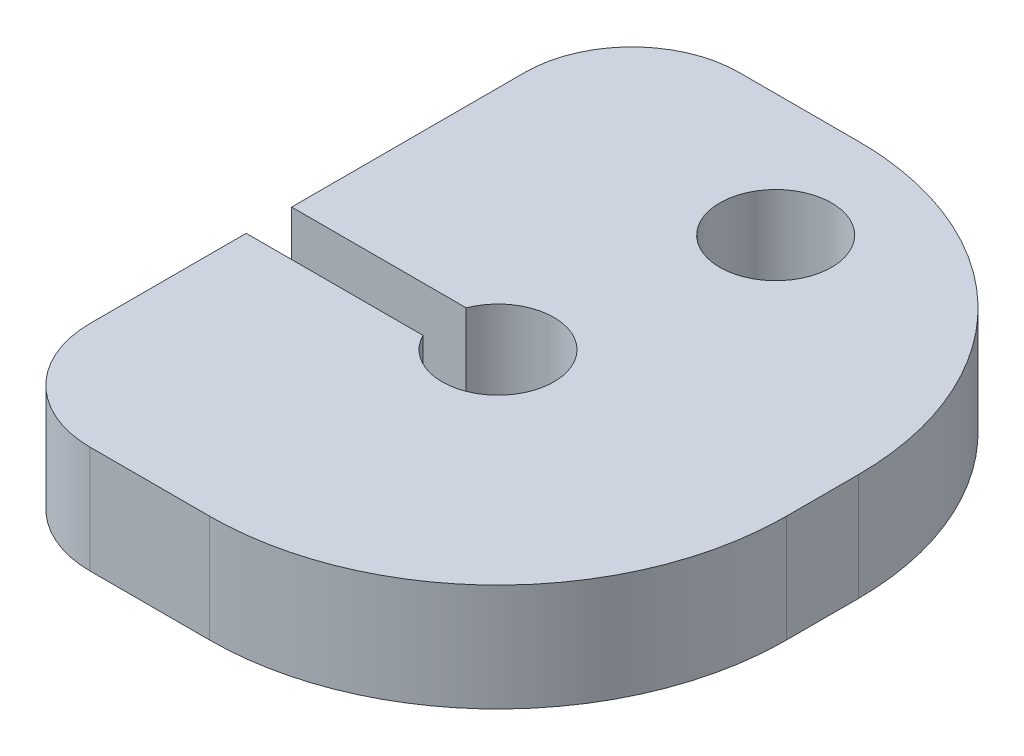
ISO-10303-21;
HEADER;
FILE_DESCRIPTION(('STEP AP214'),'2;1');
FILE_NAME('part.step','',(''),(''),'','','');
FILE_SCHEMA(('AUTOMOTIVE_DESIGN { 1 0 10303 214 1 1 1 1 }'));
ENDSEC;
DATA;
#1=APPLICATION_CONTEXT('core data for automotive mechanical design processes');
#2=APPLICATION_PROTOCOL_DEFINITION('international standard','automotive_design',2000,#1);
#3=PRODUCT_CONTEXT('',#1,'mechanical');
#4=PRODUCT('Part','Part','',(#3));
#5=PRODUCT_RELATED_PRODUCT_CATEGORY('part','',(#4));
#6=PRODUCT_DEFINITION_FORMATION('','',#4);
#7=PRODUCT_DEFINITION_CONTEXT('part definition',#1,'design');
#8=PRODUCT_DEFINITION('design','',#6,#7);
#9=PRODUCT_DEFINITION_SHAPE('','',#8);
#10=(LENGTH_UNIT() NAMED_UNIT(*) SI_UNIT(.MILLI.,.METRE.));
#11=(NAMED_UNIT(*) PLANE_ANGLE_UNIT() SI_UNIT($,.RADIAN.));
#12=(NAMED_UNIT(*) SI_UNIT($,.STERADIAN.) SOLID_ANGLE_UNIT());
#13=UNCERTAINTY_MEASURE_WITH_UNIT(LENGTH_MEASURE(1.E-05),#10,'distance_accuracy_value','');
#14=(GEOMETRIC_REPRESENTATION_CONTEXT(3) GLOBAL_UNCERTAINTY_ASSIGNED_CONTEXT((#13)) GLOBAL_UNIT_ASSIGNED_CONTEXT((#10,
#11,#12)) REPRESENTATION_CONTEXT('',''));
#15=CARTESIAN_POINT('',(0.,0.,0.));
#16=DIRECTION('',(0.,0.,1.));
#17=DIRECTION('',(1.,0.,0.));
#18=AXIS2_PLACEMENT_3D('',#15,#16,#17);
#19=CARTESIAN_POINT('',(6.04323925292594,3.175,9.60979451083559));
#20=DIRECTION('',(-1.,0.,0.));
#21=DIRECTION('',(0.,0.,1.));
#22=AXIS2_PLACEMENT_3D('',#19,#20,#21);
#23=PLANE('',#22);
#24=DIRECTION('',(0.,-1.,0.));
#25=VECTOR('',#24,1.);
#26=CARTESIAN_POINT('',(6.04323925292594,3.175,1.8203433841368));
#27=LINE('',#26,#25);
#28=CARTESIAN_POINT('',(6.04323925292594,3.175,1.8203433841368));
#29=VERTEX_POINT('',#28);
#30=CARTESIAN_POINT('',(6.04323925292594,0.,1.8203433841368));
#31=VERTEX_POINT('',#30);
#32=EDGE_CURVE('E120',#29,#31,#27,.T.);
#33=ORIENTED_EDGE('',*,*,#32,.T.);
#34=DIRECTION('',(0.,0.,-1.));
#35=VECTOR('',#34,1.);
#36=CARTESIAN_POINT('',(6.04323925292594,0.,9.60979451083559));
#37=LINE('',#36,#35);
#38=CARTESIAN_POINT('',(6.04323925292594,0.,6.43479451083559));
#39=VERTEX_POINT('',#38);
#40=EDGE_CURVE('E150',#39,#31,#37,.T.);
#41=ORIENTED_EDGE('',*,*,#40,.F.);
#42=DIRECTION('',(0.,-1.,0.));
#43=VECTOR('',#42,1.);
#44=CARTESIAN_POINT('',(6.04323925292594,3.175,6.43479451083559));
#45=LINE('',#44,#43);
#46=CARTESIAN_POINT('',(6.04323925292594,3.175,6.43479451083559));
#47=VERTEX_POINT('',#46);
#48=EDGE_CURVE('E143',#39,#47,#45,.F.);
#49=ORIENTED_EDGE('',*,*,#48,.T.);
#50=DIRECTION('',(0.,0.,-1.));
#51=VECTOR('',#50,1.);
#52=CARTESIAN_POINT('',(6.04323925292594,3.175,9.60979451083559));
#53=LINE('',#52,#51);
#54=EDGE_CURVE('E136',#47,#29,#53,.T.);
#55=ORIENTED_EDGE('',*,*,#54,.T.);
#56=EDGE_LOOP('',(#33,#41,#49,#55));
#57=FACE_BOUND('',#56,.T.);
#58=ADVANCED_FACE('F35',(#57),#23,.T.);
#59=CARTESIAN_POINT('',(-21.388760747074,3.175,9.60979451083559));
#60=DIRECTION('',(0.,0.,-1.));
#61=DIRECTION('',(-1.,0.,0.));
#62=AXIS2_PLACEMENT_3D('',#59,#60,#61);
#63=PLANE('',#62);
#64=DIRECTION('',(1.,0.,0.));
#65=VECTOR('',#64,1.);
#66=CARTESIAN_POINT('',(-21.388760747074,3.175,9.60979451083559));
#67=LINE('',#66,#65);
#68=CARTESIAN_POINT('',(9.21823925292594,3.175,9.60979451083559));
#69=VERTEX_POINT('',#68);
#70=CARTESIAN_POINT('',(12.7488392529259,3.175,9.60979451083559));
#71=VERTEX_POINT('',#70);
#72=EDGE_CURVE('E164',#69,#71,#67,.T.);
#73=ORIENTED_EDGE('',*,*,#72,.F.);
#74=DIRECTION('',(0.,-1.,0.));
#75=VECTOR('',#74,1.);
#76=CARTESIAN_POINT('',(9.21823925292594,0.,9.60979451083559));
#77=LINE('',#76,#75);
#78=CARTESIAN_POINT('',(9.21823925292594,0.,9.60979451083559));
#79=VERTEX_POINT('',#78);
#80=EDGE_CURVE('E215',#69,#79,#77,.T.);
#81=ORIENTED_EDGE('',*,*,#80,.T.);
#82=DIRECTION('',(1.,0.,0.));
#83=VECTOR('',#82,1.);
#84=CARTESIAN_POINT('',(-21.388760747074,0.,9.60979451083559));
#85=LINE('',#84,#83);
#86=CARTESIAN_POINT('',(12.7488392529259,0.,9.60979451083559));
#87=VERTEX_POINT('',#86);
#88=EDGE_CURVE('E184',#79,#87,#85,.T.);
#89=ORIENTED_EDGE('',*,*,#88,.T.);
#90=DIRECTION('',(0.,-1.,0.));
#91=VECTOR('',#90,1.);
#92=CARTESIAN_POINT('',(12.7488392529259,3.175,9.60979451083559));
#93=LINE('',#92,#91);
#94=EDGE_CURVE('E162',#87,#71,#93,.F.);
#95=ORIENTED_EDGE('',*,*,#94,.T.);
#96=EDGE_LOOP('',(#73,#81,#89,#95));
#97=FACE_BOUND('',#96,.T.);
#98=ADVANCED_FACE('F236',(#97),#63,.F.);
#99=CARTESIAN_POINT('',(-21.3887607470741,3.175,-9.59260548916441));
#100=DIRECTION('',(0.,0.,1.));
#101=DIRECTION('',(1.,0.,0.));
#102=AXIS2_PLACEMENT_3D('',#99,#100,#101);
#103=PLANE('',#102);
#104=DIRECTION('',(-1.,0.,0.));
#105=VECTOR('',#104,1.);
#106=CARTESIAN_POINT('',(-21.3887607470741,0.,-9.59260548916441));
#107=LINE('',#106,#105);
#108=CARTESIAN_POINT('',(12.7488392529259,0.,-9.59260548916441));
#109=VERTEX_POINT('',#108);
#110=CARTESIAN_POINT('',(9.21823925292594,0.,-9.59260548916441));
#111=VERTEX_POINT('',#110);
#112=EDGE_CURVE('E166',#109,#111,#107,.T.);
#113=ORIENTED_EDGE('',*,*,#112,.T.);
#114=DIRECTION('',(0.,-1.,0.));
#115=VECTOR('',#114,1.);
#116=CARTESIAN_POINT('',(9.21823925292594,3.175,-9.59260548916441));
#117=LINE('',#116,#115);
#118=CARTESIAN_POINT('',(9.21823925292594,3.175,-9.59260548916441));
#119=VERTEX_POINT('',#118);
#120=EDGE_CURVE('E11',#111,#119,#117,.F.);
#121=ORIENTED_EDGE('',*,*,#120,.T.);
#122=DIRECTION('',(-1.,0.,0.));
#123=VECTOR('',#122,1.);
#124=CARTESIAN_POINT('',(-21.3887607470741,3.175,-9.59260548916441));
#125=LINE('',#124,#123);
#126=CARTESIAN_POINT('',(12.7488392529259,3.175,-9.59260548916441));
#127=VERTEX_POINT('',#126);
#128=EDGE_CURVE('E159',#127,#119,#125,.T.);
#129=ORIENTED_EDGE('',*,*,#128,.F.);
#130=DIRECTION('',(0.,-1.,0.));
#131=VECTOR('',#130,1.);
#132=CARTESIAN_POINT('',(12.7488392529259,3.175,-9.59260548916441));
#133=LINE('',#132,#131);
#134=EDGE_CURVE('E183',#127,#109,#133,.T.);
#135=ORIENTED_EDGE('',*,*,#134,.T.);
#136=EDGE_LOOP('',(#113,#121,#129,#135));
#137=FACE_BOUND('',#136,.T.);
#138=ADVANCED_FACE('F259',(#137),#103,.F.);
#139=CARTESIAN_POINT('',(-0.0527607470740534,3.175,0.00859451083559234));
#140=DIRECTION('',(0.,1.,0.));
#141=DIRECTION('',(0.,0.,1.));
#142=AXIS2_PLACEMENT_3D('',#139,#140,#141);
#143=PLANE('',#142);
#144=DIRECTION('',(-1.,0.,0.));
#145=VECTOR('',#144,1.);
#146=CARTESIAN_POINT('',(12.984828753983,3.175,1.8203433841368));
#147=LINE('',#146,#145);
#148=CARTESIAN_POINT('',(11.2726124045834,3.175,1.8203433841368));
#149=VERTEX_POINT('',#148);
#150=EDGE_CURVE('E123',#149,#29,#147,.T.);
#151=ORIENTED_EDGE('',*,*,#150,.T.);
#152=ORIENTED_EDGE('',*,*,#54,.F.);
#153=CARTESIAN_POINT('',(9.21823925292594,3.175,6.43479451083559));
#154=DIRECTION('',(0.,1.,0.));
#155=DIRECTION('',(0.,0.,1.));
#156=AXIS2_PLACEMENT_3D('',#153,#154,#155);
#157=CIRCLE('',#156,3.175);
#158=EDGE_CURVE('E43',#47,#69,#157,.T.);
#159=ORIENTED_EDGE('',*,*,#158,.T.);
#160=ORIENTED_EDGE('',*,*,#72,.T.);
#161=CARTESIAN_POINT('',(12.7488392529259,3.175,9.60979451083559));
#162=CARTESIAN_POINT('',(17.748175026209,3.175,9.60979451083559));
#163=CARTESIAN_POINT('',(21.2832392529259,3.175,6.07473028411865));
#164=CARTESIAN_POINT('',(21.2832392529259,3.175,1.07539451083559));
#165=(BOUNDED_CURVE() B_SPLINE_CURVE(3,(#161,#162,#163,#164),.UNSPECIFIED.,.F.,
.F.) B_SPLINE_CURVE_WITH_KNOTS((4,4),(0.,1.),
.UNSPECIFIED.) CURVE() GEOMETRIC_REPRESENTATION_ITEM() RATIONAL_B_SPLINE_CURVE((1.,
0.804737854124365,0.804737854124365,1.)) REPRESENTATION_ITEM(''));
#166=CARTESIAN_POINT('',(21.2832392529259,3.175,1.07539451083559));
#167=VERTEX_POINT('',#166);
#168=EDGE_CURVE('E167',#71,#167,#165,.T.);
#169=ORIENTED_EDGE('',*,*,#168,.T.);
#170=DIRECTION('',(0.,0.,-1.));
#171=VECTOR('',#170,1.);
#172=CARTESIAN_POINT('',(21.2832392529259,3.175,-9.59260548916441));
#173=LINE('',#172,#171);
#174=CARTESIAN_POINT('',(21.2832392529259,3.175,-1.05820548916441));
#175=VERTEX_POINT('',#174);
#176=EDGE_CURVE('E163',#167,#175,#173,.T.);
#177=ORIENTED_EDGE('',*,*,#176,.T.);
#178=CARTESIAN_POINT('',(21.2832392529259,3.175,-1.05820548916441));
#179=CARTESIAN_POINT('',(21.2832392529259,3.175,-6.05754126244746));
#180=CARTESIAN_POINT('',(17.748175026209,3.175,-9.59260548916441));
#181=CARTESIAN_POINT('',(12.7488392529259,3.175,-9.59260548916441));
#182=(BOUNDED_CURVE() B_SPLINE_CURVE(3,(#178,#179,#180,#181),.UNSPECIFIED.,.F.,
.F.) B_SPLINE_CURVE_WITH_KNOTS((4,4),(0.,1.),
.UNSPECIFIED.) CURVE() GEOMETRIC_REPRESENTATION_ITEM() RATIONAL_B_SPLINE_CURVE((1.,
0.804737854124365,0.804737854124365,1.)) REPRESENTATION_ITEM(''));
#183=EDGE_CURVE('E178',#175,#127,#182,.T.);
#184=ORIENTED_EDGE('',*,*,#183,.T.);
#185=ORIENTED_EDGE('',*,*,#128,.T.);
#186=CARTESIAN_POINT('',(9.21823925292594,3.175,-6.41760548916441));
#187=DIRECTION('',(0.,1.,0.));
#188=DIRECTION('',(0.,0.,1.));
#189=AXIS2_PLACEMENT_3D('',#186,#187,#188);
#190=CIRCLE('',#189,3.175);
#191=CARTESIAN_POINT('',(6.04323925292594,3.175,-6.41760548916441));
#192=VERTEX_POINT('',#191);
#193=EDGE_CURVE('E230',#119,#192,#190,.T.);
#194=ORIENTED_EDGE('',*,*,#193,.T.);
#195=CARTESIAN_POINT('',(6.04323925292594,3.175,0.47539787418271));
#196=VERTEX_POINT('',#195);
#197=EDGE_CURVE('E145',#196,#192,#53,.T.);
#198=ORIENTED_EDGE('',*,*,#197,.F.);
#199=DIRECTION('',(1.,0.,0.));
#200=VECTOR('',#199,1.);
#201=CARTESIAN_POINT('',(6.04323925292594,3.175,0.475397874182709));
#202=LINE('',#201,#200);
#203=CARTESIAN_POINT('',(11.207995793127,3.175,0.475397874182709));
#204=VERTEX_POINT('',#203);
#205=EDGE_CURVE('E50',#196,#204,#202,.T.);
#206=ORIENTED_EDGE('',*,*,#205,.T.);
#207=CARTESIAN_POINT('',(12.7488392529259,3.175,1.07539451083559));
#208=DIRECTION('',(0.,1.,0.));
#209=DIRECTION('',(0.,0.,1.));
#210=AXIS2_PLACEMENT_3D('',#207,#208,#209);
#211=CIRCLE('',#210,1.65354);
#212=EDGE_CURVE('E139',#149,#204,#211,.T.);
#213=ORIENTED_EDGE('',*,*,#212,.F.);
#214=EDGE_LOOP('',(#151,#152,#159,#160,#169,#177,#184,#185,#194,#198,#206,#213));
#215=FACE_BOUND('',#214,.T.);
#216=CARTESIAN_POINT('',(13.9223192529259,3.175,-5.96548548916441));
#217=DIRECTION('',(0.,1.,0.));
#218=DIRECTION('',(0.,0.,1.));
#219=AXIS2_PLACEMENT_3D('',#216,#217,#218);
#220=CIRCLE('',#219,1.65354);
#221=CARTESIAN_POINT('',(13.9223192529259,3.175,-4.31194548916441));
#222=VERTEX_POINT('',#221);
#223=EDGE_CURVE('E144',#222,#222,#220,.T.);
#224=ORIENTED_EDGE('',*,*,#223,.F.);
#225=EDGE_LOOP('',(#224));
#226=FACE_BOUND('',#225,.T.);
#227=ADVANCED_FACE('F134',(#215,#226),#143,.T.);
#228=CARTESIAN_POINT('',(-0.0527607470740534,0.,0.00859451083559234));
#229=DIRECTION('',(0.,1.,0.));
#230=DIRECTION('',(0.,0.,1.));
#231=AXIS2_PLACEMENT_3D('',#228,#229,#230);
#232=PLANE('',#231);
#233=ORIENTED_EDGE('',*,*,#40,.T.);
#234=DIRECTION('',(-1.,0.,0.));
#235=VECTOR('',#234,1.);
#236=CARTESIAN_POINT('',(12.984828753983,0.,1.8203433841368));
#237=LINE('',#236,#235);
#238=CARTESIAN_POINT('',(11.2726124045834,0.,1.8203433841368));
#239=VERTEX_POINT('',#238);
#240=EDGE_CURVE('E58',#239,#31,#237,.T.);
#241=ORIENTED_EDGE('',*,*,#240,.F.);
#242=CARTESIAN_POINT('',(12.7488392529259,0.,1.07539451083559));
#243=DIRECTION('',(0.,1.,0.));
#244=DIRECTION('',(0.,0.,1.));
#245=AXIS2_PLACEMENT_3D('',#242,#243,#244);
#246=CIRCLE('',#245,1.65354);
#247=CARTESIAN_POINT('',(11.207995793127,0.,0.475397874182709));
#248=VERTEX_POINT('',#247);
#249=EDGE_CURVE('E158',#239,#248,#246,.T.);
#250=ORIENTED_EDGE('',*,*,#249,.T.);
#251=DIRECTION('',(1.,0.,0.));
#252=VECTOR('',#251,1.);
#253=CARTESIAN_POINT('',(6.04323925292594,0.,0.475397874182709));
#254=LINE('',#253,#252);
#255=CARTESIAN_POINT('',(6.04323925292594,0.,0.475397874182709));
#256=VERTEX_POINT('',#255);
#257=EDGE_CURVE('E140',#256,#248,#254,.T.);
#258=ORIENTED_EDGE('',*,*,#257,.F.);
#259=CARTESIAN_POINT('',(6.04323925292594,0.,-6.41760548916441));
#260=VERTEX_POINT('',#259);
#261=EDGE_CURVE('E155',#256,#260,#37,.T.);
#262=ORIENTED_EDGE('',*,*,#261,.T.);
#263=CARTESIAN_POINT('',(9.21823925292594,0.,-6.41760548916441));
#264=DIRECTION('',(0.,1.,0.));
#265=DIRECTION('',(0.,0.,1.));
#266=AXIS2_PLACEMENT_3D('',#263,#264,#265);
#267=CIRCLE('',#266,3.175);
#268=EDGE_CURVE('E222',#260,#111,#267,.F.);
#269=ORIENTED_EDGE('',*,*,#268,.T.);
#270=ORIENTED_EDGE('',*,*,#112,.F.);
#271=CARTESIAN_POINT('',(21.2832392529259,0.,-1.05820548916441));
#272=CARTESIAN_POINT('',(21.2832392529259,0.,-6.05754126244746));
#273=CARTESIAN_POINT('',(17.748175026209,0.,-9.59260548916441));
#274=CARTESIAN_POINT('',(12.7488392529259,0.,-9.59260548916441));
#275=(BOUNDED_CURVE() B_SPLINE_CURVE(3,(#271,#272,#273,#274),.UNSPECIFIED.,.F.,
.F.) B_SPLINE_CURVE_WITH_KNOTS((4,4),(0.,1.),
.UNSPECIFIED.) CURVE() GEOMETRIC_REPRESENTATION_ITEM() RATIONAL_B_SPLINE_CURVE((1.,
0.804737854124365,0.804737854124365,1.)) REPRESENTATION_ITEM(''));
#276=CARTESIAN_POINT('',(21.2832392529259,0.,-1.05820548916441));
#277=VERTEX_POINT('',#276);
#278=EDGE_CURVE('E198',#109,#277,#275,.F.);
#279=ORIENTED_EDGE('',*,*,#278,.T.);
#280=DIRECTION('',(0.,0.,-1.));
#281=VECTOR('',#280,1.);
#282=CARTESIAN_POINT('',(21.2832392529259,0.,-9.59260548916441));
#283=LINE('',#282,#281);
#284=CARTESIAN_POINT('',(21.2832392529259,0.,1.07539451083559));
#285=VERTEX_POINT('',#284);
#286=EDGE_CURVE('E189',#285,#277,#283,.T.);
#287=ORIENTED_EDGE('',*,*,#286,.F.);
#288=CARTESIAN_POINT('',(12.7488392529259,0.,9.60979451083559));
#289=CARTESIAN_POINT('',(17.748175026209,0.,9.60979451083559));
#290=CARTESIAN_POINT('',(21.2832392529259,0.,6.07473028411865));
#291=CARTESIAN_POINT('',(21.2832392529259,0.,1.07539451083559));
#292=(BOUNDED_CURVE() B_SPLINE_CURVE(3,(#288,#289,#290,#291),.UNSPECIFIED.,.F.,
.F.) B_SPLINE_CURVE_WITH_KNOTS((4,4),(0.,1.),
.UNSPECIFIED.) CURVE() GEOMETRIC_REPRESENTATION_ITEM() RATIONAL_B_SPLINE_CURVE((1.,
0.804737854124365,0.804737854124365,1.)) REPRESENTATION_ITEM(''));
#293=EDGE_CURVE('E172',#285,#87,#292,.F.);
#294=ORIENTED_EDGE('',*,*,#293,.T.);
#295=ORIENTED_EDGE('',*,*,#88,.F.);
#296=CARTESIAN_POINT('',(9.21823925292594,0.,6.43479451083559));
#297=DIRECTION('',(0.,1.,0.));
#298=DIRECTION('',(0.,0.,1.));
#299=AXIS2_PLACEMENT_3D('',#296,#297,#298);
#300=CIRCLE('',#299,3.175);
#301=EDGE_CURVE('E224',#79,#39,#300,.F.);
#302=ORIENTED_EDGE('',*,*,#301,.T.);
#303=EDGE_LOOP('',(#233,#241,#250,#258,#262,#269,#270,#279,#287,#294,#295,#302));
#304=FACE_BOUND('',#303,.T.);
#305=CARTESIAN_POINT('',(13.9223192529259,0.,-5.96548548916441));
#306=DIRECTION('',(0.,1.,0.));
#307=DIRECTION('',(0.,0.,1.));
#308=AXIS2_PLACEMENT_3D('',#305,#306,#307);
#309=CIRCLE('',#308,1.65354);
#310=CARTESIAN_POINT('',(13.9223192529259,0.,-4.31194548916441));
#311=VERTEX_POINT('',#310);
#312=EDGE_CURVE('E148',#311,#311,#309,.T.);
#313=ORIENTED_EDGE('',*,*,#312,.T.);
#314=EDGE_LOOP('',(#313));
#315=FACE_BOUND('',#314,.T.);
#316=ADVANCED_FACE('F242',(#304,#315),#232,.F.);
#317=CARTESIAN_POINT('',(21.2832392529259,3.175,-9.59260548916441));
#318=DIRECTION('',(-1.,0.,0.));
#319=DIRECTION('',(0.,0.,1.));
#320=AXIS2_PLACEMENT_3D('',#317,#318,#319);
#321=PLANE('',#320);
#322=ORIENTED_EDGE('',*,*,#286,.T.);
#323=DIRECTION('',(0.,-1.,0.));
#324=VECTOR('',#323,1.);
#325=CARTESIAN_POINT('',(21.2832392529259,3.175,-1.05820548916441));
#326=LINE('',#325,#324);
#327=EDGE_CURVE('E182',#277,#175,#326,.F.);
#328=ORIENTED_EDGE('',*,*,#327,.T.);
#329=ORIENTED_EDGE('',*,*,#176,.F.);
#330=DIRECTION('',(0.,-1.,0.));
#331=VECTOR('',#330,1.);
#332=CARTESIAN_POINT('',(21.2832392529259,3.175,1.07539451083559));
#333=LINE('',#332,#331);
#334=EDGE_CURVE('E171',#167,#285,#333,.T.);
#335=ORIENTED_EDGE('',*,*,#334,.T.);
#336=EDGE_LOOP('',(#322,#328,#329,#335));
#337=FACE_BOUND('',#336,.T.);
#338=ADVANCED_FACE('F251',(#337),#321,.F.);
#339=CARTESIAN_POINT('',(12.7488392529259,3.175,1.07539451083559));
#340=DIRECTION('',(0.,-1.,0.));
#341=DIRECTION('',(0.,0.,-1.));
#342=AXIS2_PLACEMENT_3D('',#339,#340,#341);
#343=CYLINDRICAL_SURFACE('',#342,8.5344);
#344=ORIENTED_EDGE('',*,*,#168,.F.);
#345=ORIENTED_EDGE('',*,*,#94,.F.);
#346=ORIENTED_EDGE('',*,*,#293,.F.);
#347=ORIENTED_EDGE('',*,*,#334,.F.);
#348=EDGE_LOOP('',(#344,#345,#346,#347));
#349=FACE_BOUND('',#348,.T.);
#350=ADVANCED_FACE('F247',(#349),#343,.T.);
#351=CARTESIAN_POINT('',(12.7488392529259,0.,1.07539451083559));
#352=DIRECTION('',(0.,1.,0.));
#353=DIRECTION('',(0.,0.,1.));
#354=AXIS2_PLACEMENT_3D('',#351,#352,#353);
#355=CYLINDRICAL_SURFACE('',#354,1.65354);
#356=ORIENTED_EDGE('',*,*,#249,.F.);
#357=DIRECTION('',(0.,1.,0.));
#358=VECTOR('',#357,1.);
#359=CARTESIAN_POINT('',(11.2726124045834,0.,1.8203433841368));
#360=LINE('',#359,#358);
#361=EDGE_CURVE('E153',#239,#149,#360,.T.);
#362=ORIENTED_EDGE('',*,*,#361,.T.);
#363=ORIENTED_EDGE('',*,*,#212,.T.);
#364=DIRECTION('',(0.,1.,0.));
#365=VECTOR('',#364,1.);
#366=CARTESIAN_POINT('',(11.207995793127,0.,0.475397874182709));
#367=LINE('',#366,#365);
#368=EDGE_CURVE('E270',#204,#248,#367,.F.);
#369=ORIENTED_EDGE('',*,*,#368,.T.);
#370=EDGE_LOOP('',(#356,#362,#363,#369));
#371=FACE_BOUND('',#370,.T.);
#372=ADVANCED_FACE('F279',(#371),#355,.F.);
#373=CARTESIAN_POINT('',(13.9223192529259,0.,-5.96548548916441));
#374=DIRECTION('',(0.,1.,0.));
#375=DIRECTION('',(0.,0.,1.));
#376=AXIS2_PLACEMENT_3D('',#373,#374,#375);
#377=CYLINDRICAL_SURFACE('',#376,1.65354);
#378=ORIENTED_EDGE('',*,*,#312,.F.);
#379=EDGE_LOOP('',(#378));
#380=FACE_BOUND('',#379,.T.);
#381=ORIENTED_EDGE('',*,*,#223,.T.);
#382=EDGE_LOOP('',(#381));
#383=FACE_BOUND('',#382,.T.);
#384=ADVANCED_FACE('F281',(#380,#383),#377,.F.);
#385=CARTESIAN_POINT('',(12.7488392529259,3.175,-1.05820548916441));
#386=DIRECTION('',(0.,-1.,0.));
#387=DIRECTION('',(0.,0.,-1.));
#388=AXIS2_PLACEMENT_3D('',#385,#386,#387);
#389=CYLINDRICAL_SURFACE('',#388,8.5344);
#390=ORIENTED_EDGE('',*,*,#183,.F.);
#391=ORIENTED_EDGE('',*,*,#327,.F.);
#392=ORIENTED_EDGE('',*,*,#278,.F.);
#393=ORIENTED_EDGE('',*,*,#134,.F.);
#394=EDGE_LOOP('',(#390,#391,#392,#393));
#395=FACE_BOUND('',#394,.T.);
#396=ADVANCED_FACE('F254',(#395),#389,.T.);
#397=DIRECTION('',(0.,-1.,0.));
#398=VECTOR('',#397,1.);
#399=CARTESIAN_POINT('',(6.04323925292594,3.175,0.475397874182709));
#400=LINE('',#399,#398);
#401=EDGE_CURVE('E129',#196,#256,#400,.T.);
#402=ORIENTED_EDGE('',*,*,#401,.F.);
#403=ORIENTED_EDGE('',*,*,#197,.T.);
#404=DIRECTION('',(0.,-1.,0.));
#405=VECTOR('',#404,1.);
#406=CARTESIAN_POINT('',(6.04323925292594,0.,-6.41760548916441));
#407=LINE('',#406,#405);
#408=EDGE_CURVE('E226',#192,#260,#407,.T.);
#409=ORIENTED_EDGE('',*,*,#408,.T.);
#410=ORIENTED_EDGE('',*,*,#261,.F.);
#411=EDGE_LOOP('',(#402,#403,#409,#410));
#412=FACE_BOUND('',#411,.T.);
#413=ADVANCED_FACE('F267',(#412),#23,.T.);
#414=CARTESIAN_POINT('',(9.21823925292594,3.175,6.43479451083559));
#415=DIRECTION('',(0.,1.,0.));
#416=DIRECTION('',(0.,0.,1.));
#417=AXIS2_PLACEMENT_3D('',#414,#415,#416);
#418=CYLINDRICAL_SURFACE('',#417,3.175);
#419=ORIENTED_EDGE('',*,*,#158,.F.);
#420=ORIENTED_EDGE('',*,*,#48,.F.);
#421=ORIENTED_EDGE('',*,*,#301,.F.);
#422=ORIENTED_EDGE('',*,*,#80,.F.);
#423=EDGE_LOOP('',(#419,#420,#421,#422));
#424=FACE_BOUND('',#423,.T.);
#425=ADVANCED_FACE('F240',(#424),#418,.T.);
#426=CARTESIAN_POINT('',(9.21823925292594,3.175,-6.41760548916441));
#427=DIRECTION('',(0.,1.,0.));
#428=DIRECTION('',(0.,0.,1.));
#429=AXIS2_PLACEMENT_3D('',#426,#427,#428);
#430=CYLINDRICAL_SURFACE('',#429,3.175);
#431=ORIENTED_EDGE('',*,*,#193,.F.);
#432=ORIENTED_EDGE('',*,*,#120,.F.);
#433=ORIENTED_EDGE('',*,*,#268,.F.);
#434=ORIENTED_EDGE('',*,*,#408,.F.);
#435=EDGE_LOOP('',(#431,#432,#433,#434));
#436=FACE_BOUND('',#435,.T.);
#437=ADVANCED_FACE('F37',(#436),#430,.T.);
#438=CARTESIAN_POINT('',(6.04323925292594,3.175,0.475397874182709));
#439=DIRECTION('',(0.,0.,-1.));
#440=DIRECTION('',(-1.,0.,0.));
#441=AXIS2_PLACEMENT_3D('',#438,#439,#440);
#442=PLANE('',#441);
#443=ORIENTED_EDGE('',*,*,#205,.F.);
#444=ORIENTED_EDGE('',*,*,#401,.T.);
#445=ORIENTED_EDGE('',*,*,#257,.T.);
#446=ORIENTED_EDGE('',*,*,#368,.F.);
#447=EDGE_LOOP('',(#443,#444,#445,#446));
#448=FACE_BOUND('',#447,.T.);
#449=ADVANCED_FACE('F276',(#448),#442,.F.);
#450=CARTESIAN_POINT('',(12.984828753983,3.175,1.8203433841368));
#451=DIRECTION('',(0.,0.,1.));
#452=DIRECTION('',(1.,0.,0.));
#453=AXIS2_PLACEMENT_3D('',#450,#451,#452);
#454=PLANE('',#453);
#455=ORIENTED_EDGE('',*,*,#240,.T.);
#456=ORIENTED_EDGE('',*,*,#32,.F.);
#457=ORIENTED_EDGE('',*,*,#150,.F.);
#458=ORIENTED_EDGE('',*,*,#361,.F.);
#459=EDGE_LOOP('',(#455,#456,#457,#458));
#460=FACE_BOUND('',#459,.T.);
#461=ADVANCED_FACE('F122',(#460),#454,.F.);
#462=CLOSED_SHELL('',(#58,#98,#138,#227,#316,#338,#350,#372,#384,#396,#413,#425,#437,#449,#461));
#463=MANIFOLD_SOLID_BREP('B2',#462);
#464=ADVANCED_BREP_SHAPE_REPRESENTATION('',(#18,#463),#14);
#465=SHAPE_DEFINITION_REPRESENTATION(#9,#464);
ENDSEC;
END-ISO-10303-21;
